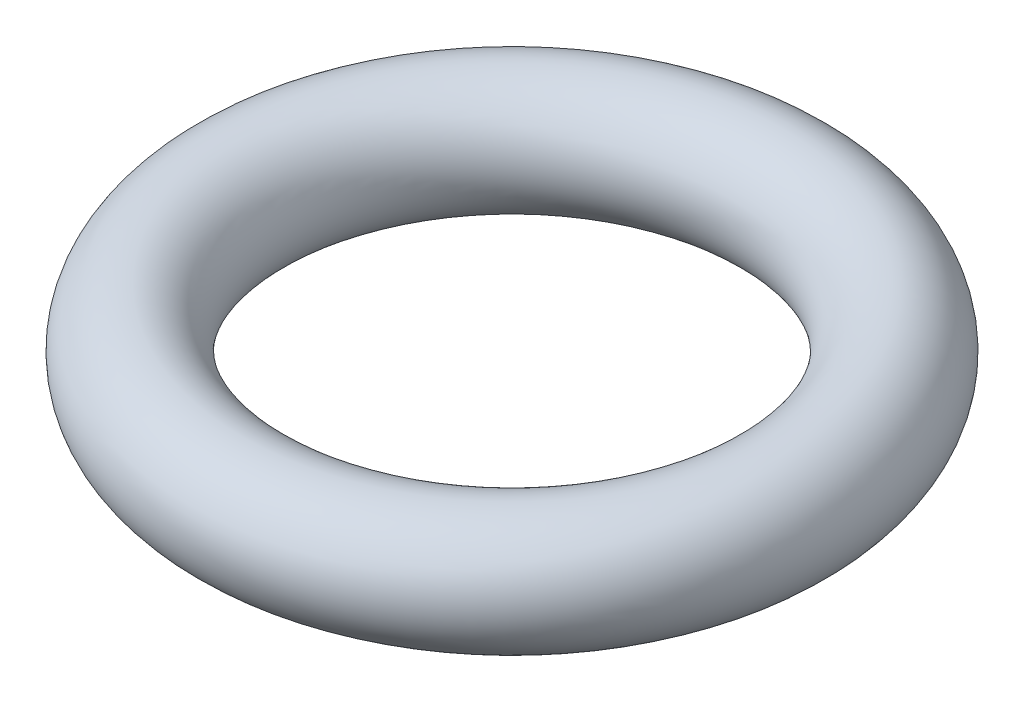
ISO-10303-21;
HEADER;
FILE_DESCRIPTION(('STEP AP214'),'2;1');
FILE_NAME('part.step','',(''),(''),'','','');
FILE_SCHEMA(('AUTOMOTIVE_DESIGN { 1 0 10303 214 1 1 1 1 }'));
ENDSEC;
DATA;
#1=APPLICATION_CONTEXT('core data for automotive mechanical design processes');
#2=APPLICATION_PROTOCOL_DEFINITION('international standard','automotive_design',2000,#1);
#3=PRODUCT_CONTEXT('',#1,'mechanical');
#4=PRODUCT('Part','Part','',(#3));
#5=PRODUCT_RELATED_PRODUCT_CATEGORY('part','',(#4));
#6=PRODUCT_DEFINITION_FORMATION('','',#4);
#7=PRODUCT_DEFINITION_CONTEXT('part definition',#1,'design');
#8=PRODUCT_DEFINITION('design','',#6,#7);
#9=PRODUCT_DEFINITION_SHAPE('','',#8);
#10=(LENGTH_UNIT() NAMED_UNIT(*) SI_UNIT(.MILLI.,.METRE.));
#11=(NAMED_UNIT(*) PLANE_ANGLE_UNIT() SI_UNIT($,.RADIAN.));
#12=(NAMED_UNIT(*) SI_UNIT($,.STERADIAN.) SOLID_ANGLE_UNIT());
#13=UNCERTAINTY_MEASURE_WITH_UNIT(LENGTH_MEASURE(1.E-05),#10,'distance_accuracy_value','');
#14=(GEOMETRIC_REPRESENTATION_CONTEXT(3) GLOBAL_UNCERTAINTY_ASSIGNED_CONTEXT((#13)) GLOBAL_UNIT_ASSIGNED_CONTEXT((#10,
#11,#12)) REPRESENTATION_CONTEXT('',''));
#15=CARTESIAN_POINT('',(0.,0.,0.));
#16=DIRECTION('',(0.,0.,1.));
#17=DIRECTION('',(1.,0.,0.));
#18=AXIS2_PLACEMENT_3D('',#15,#16,#17);
#19=CARTESIAN_POINT('',(0.,0.,0.));
#20=DIRECTION('',(0.,1.,0.));
#21=DIRECTION('',(0.,0.,1.));
#22=AXIS2_PLACEMENT_3D('',#19,#20,#21);
#23=TOROIDAL_SURFACE('',#22,3.65,0.799999999999999);
#24=CARTESIAN_POINT('',(0.,0.,-3.65));
#25=DIRECTION('',(1.,0.,0.));
#26=DIRECTION('',(0.,0.,-1.));
#27=AXIS2_PLACEMENT_3D('',#24,#25,#26);
#28=CIRCLE('',#27,0.799999999999999);
#29=CARTESIAN_POINT('',(0.,0.,-4.45));
#30=VERTEX_POINT('',#29);
#31=EDGE_CURVE('E10',#30,#30,#28,.T.);
#32=CARTESIAN_POINT('',(0.,0.,0.));
#33=DIRECTION('',(0.,1.,0.));
#34=DIRECTION('',(0.,0.,1.));
#35=AXIS2_PLACEMENT_3D('',#32,#33,#34);
#36=CIRCLE('',#35,4.45);
#37=EDGE_CURVE('',#30,#30,#36,.T.);
#38=ORIENTED_EDGE('',*,*,#31,.F.);
#39=ORIENTED_EDGE('',*,*,#31,.T.);
#40=ORIENTED_EDGE('',*,*,#37,.T.);
#41=ORIENTED_EDGE('',*,*,#37,.F.);
#42=EDGE_LOOP('',(#38,#40,#39,#41));
#43=FACE_BOUND('',#42,.T.);
#44=ADVANCED_FACE('F37',(#43),#23,.T.);
#45=CLOSED_SHELL('',(#44));
#46=MANIFOLD_SOLID_BREP('B2',#45);
#47=ADVANCED_BREP_SHAPE_REPRESENTATION('',(#18,#46),#14);
#48=SHAPE_DEFINITION_REPRESENTATION(#9,#47);
ENDSEC;
END-ISO-10303-21;
